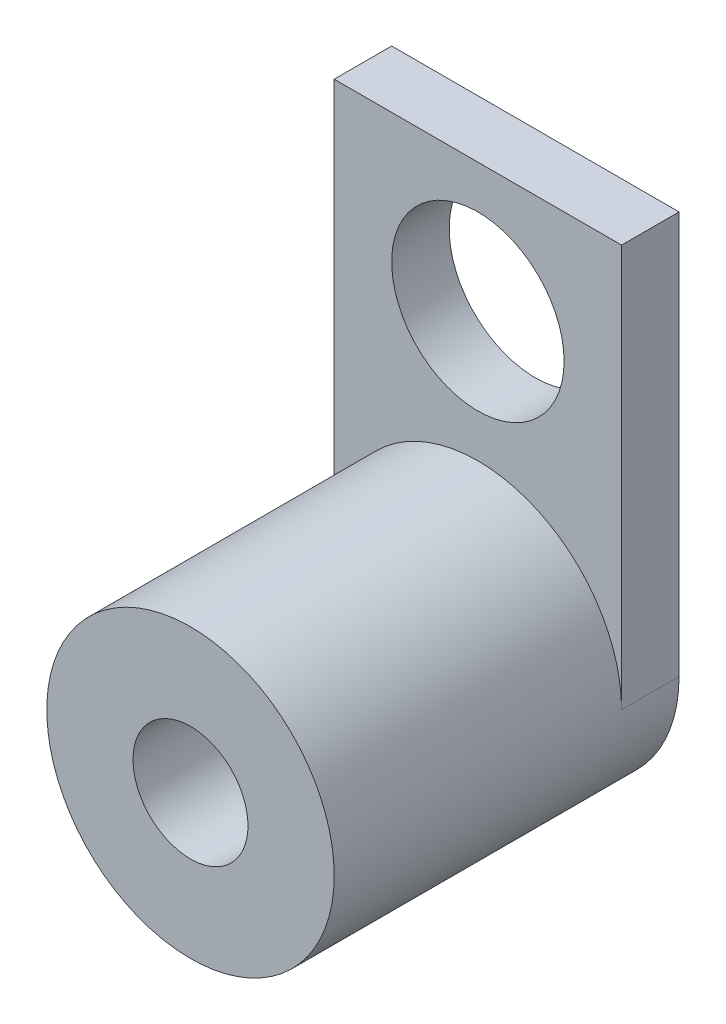
ISO-10303-21;
HEADER;
FILE_DESCRIPTION(('STEP AP214'),'2;1');
FILE_NAME('part.step','',(''),(''),'','','');
FILE_SCHEMA(('AUTOMOTIVE_DESIGN { 1 0 10303 214 1 1 1 1 }'));
ENDSEC;
DATA;
#1=APPLICATION_CONTEXT('core data for automotive mechanical design processes');
#2=APPLICATION_PROTOCOL_DEFINITION('international standard','automotive_design',2000,#1);
#3=PRODUCT_CONTEXT('',#1,'mechanical');
#4=PRODUCT('Part','Part','',(#3));
#5=PRODUCT_RELATED_PRODUCT_CATEGORY('part','',(#4));
#6=PRODUCT_DEFINITION_FORMATION('','',#4);
#7=PRODUCT_DEFINITION_CONTEXT('part definition',#1,'design');
#8=PRODUCT_DEFINITION('design','',#6,#7);
#9=PRODUCT_DEFINITION_SHAPE('','',#8);
#10=(LENGTH_UNIT() NAMED_UNIT(*) SI_UNIT(.MILLI.,.METRE.));
#11=(NAMED_UNIT(*) PLANE_ANGLE_UNIT() SI_UNIT($,.RADIAN.));
#12=(NAMED_UNIT(*) SI_UNIT($,.STERADIAN.) SOLID_ANGLE_UNIT());
#13=UNCERTAINTY_MEASURE_WITH_UNIT(LENGTH_MEASURE(1.E-05),#10,'distance_accuracy_value','');
#14=(GEOMETRIC_REPRESENTATION_CONTEXT(3) GLOBAL_UNCERTAINTY_ASSIGNED_CONTEXT((#13)) GLOBAL_UNIT_ASSIGNED_CONTEXT((#10,
#11,#12)) REPRESENTATION_CONTEXT('',''));
#15=CARTESIAN_POINT('',(0.,0.,0.));
#16=DIRECTION('',(0.,0.,1.));
#17=DIRECTION('',(1.,0.,0.));
#18=AXIS2_PLACEMENT_3D('',#15,#16,#17);
#19=CARTESIAN_POINT('',(0.,0.,152.4));
#20=DIRECTION('',(0.,0.,1.));
#21=DIRECTION('',(1.,0.,0.));
#22=AXIS2_PLACEMENT_3D('',#19,#20,#21);
#23=PLANE('',#22);
#24=CARTESIAN_POINT('',(0.,0.,152.4));
#25=DIRECTION('',(0.,0.,1.));
#26=DIRECTION('',(1.,0.,0.));
#27=AXIS2_PLACEMENT_3D('',#24,#25,#26);
#28=CIRCLE('',#27,63.5);
#29=CARTESIAN_POINT('',(63.5,0.,152.4));
#30=VERTEX_POINT('',#29);
#31=EDGE_CURVE('E11',#30,#30,#28,.T.);
#32=ORIENTED_EDGE('',*,*,#31,.T.);
#33=EDGE_LOOP('',(#32));
#34=FACE_BOUND('',#33,.T.);
#35=CARTESIAN_POINT('',(0.,0.,152.4));
#36=DIRECTION('',(0.,0.,1.));
#37=DIRECTION('',(1.,0.,0.));
#38=AXIS2_PLACEMENT_3D('',#35,#36,#37);
#39=CIRCLE('',#38,25.4);
#40=CARTESIAN_POINT('',(-25.4,0.,152.4));
#41=VERTEX_POINT('',#40);
#42=EDGE_CURVE('E134',#41,#41,#39,.T.);
#43=ORIENTED_EDGE('',*,*,#42,.F.);
#44=EDGE_LOOP('',(#43));
#45=FACE_BOUND('',#44,.T.);
#46=ADVANCED_FACE('F45',(#34,#45),#23,.T.);
#47=CARTESIAN_POINT('',(0.,0.,0.));
#48=DIRECTION('',(0.,0.,1.));
#49=DIRECTION('',(1.,0.,0.));
#50=AXIS2_PLACEMENT_3D('',#47,#48,#49);
#51=PLANE('',#50);
#52=CARTESIAN_POINT('',(0.,0.,0.));
#53=DIRECTION('',(0.,0.,1.));
#54=DIRECTION('',(1.,0.,0.));
#55=AXIS2_PLACEMENT_3D('',#52,#53,#54);
#56=CIRCLE('',#55,63.5);
#57=CARTESIAN_POINT('',(-63.5,0.,0.));
#58=VERTEX_POINT('',#57);
#59=CARTESIAN_POINT('',(63.5,0.,0.));
#60=VERTEX_POINT('',#59);
#61=EDGE_CURVE('E49',#58,#60,#56,.T.);
#62=ORIENTED_EDGE('',*,*,#61,.F.);
#63=DIRECTION('',(0.,-1.,0.));
#64=VECTOR('',#63,1.);
#65=CARTESIAN_POINT('',(-63.5,0.,0.));
#66=LINE('',#65,#64);
#67=CARTESIAN_POINT('',(-63.5,177.8,0.));
#68=VERTEX_POINT('',#67);
#69=EDGE_CURVE('E61',#68,#58,#66,.T.);
#70=ORIENTED_EDGE('',*,*,#69,.F.);
#71=DIRECTION('',(-1.,0.,0.));
#72=VECTOR('',#71,1.);
#73=CARTESIAN_POINT('',(-63.5,177.8,0.));
#74=LINE('',#73,#72);
#75=CARTESIAN_POINT('',(63.5,177.8,0.));
#76=VERTEX_POINT('',#75);
#77=EDGE_CURVE('E87',#76,#68,#74,.T.);
#78=ORIENTED_EDGE('',*,*,#77,.F.);
#79=DIRECTION('',(0.,1.,0.));
#80=VECTOR('',#79,1.);
#81=CARTESIAN_POINT('',(63.5,0.,0.));
#82=LINE('',#81,#80);
#83=EDGE_CURVE('E105',#60,#76,#82,.T.);
#84=ORIENTED_EDGE('',*,*,#83,.F.);
#85=EDGE_LOOP('',(#62,#70,#78,#84));
#86=FACE_BOUND('',#85,.T.);
#87=CARTESIAN_POINT('',(0.,0.,0.));
#88=DIRECTION('',(0.,0.,1.));
#89=DIRECTION('',(1.,0.,0.));
#90=AXIS2_PLACEMENT_3D('',#87,#88,#89);
#91=CIRCLE('',#90,25.4);
#92=CARTESIAN_POINT('',(-25.4,0.,0.));
#93=VERTEX_POINT('',#92);
#94=EDGE_CURVE('E133',#93,#93,#91,.T.);
#95=ORIENTED_EDGE('',*,*,#94,.T.);
#96=EDGE_LOOP('',(#95));
#97=FACE_BOUND('',#96,.T.);
#98=CARTESIAN_POINT('',(0.,120.65,0.));
#99=DIRECTION('',(0.,0.,1.));
#100=DIRECTION('',(1.,0.,0.));
#101=AXIS2_PLACEMENT_3D('',#98,#99,#100);
#102=CIRCLE('',#101,38.1);
#103=CARTESIAN_POINT('',(38.1,120.65,0.));
#104=VERTEX_POINT('',#103);
#105=EDGE_CURVE('E239',#104,#104,#102,.T.);
#106=ORIENTED_EDGE('',*,*,#105,.T.);
#107=EDGE_LOOP('',(#106));
#108=FACE_BOUND('',#107,.T.);
#109=ADVANCED_FACE('F142',(#86,#97,#108),#51,.F.);
#110=CARTESIAN_POINT('',(0.,0.,152.4));
#111=DIRECTION('',(0.,0.,-1.));
#112=DIRECTION('',(-1.,0.,0.));
#113=AXIS2_PLACEMENT_3D('',#110,#111,#112);
#114=CYLINDRICAL_SURFACE('',#113,63.5);
#115=ORIENTED_EDGE('',*,*,#31,.F.);
#116=EDGE_LOOP('',(#115));
#117=FACE_BOUND('',#116,.T.);
#118=CARTESIAN_POINT('',(0.,0.,25.4));
#119=DIRECTION('',(0.,0.,1.));
#120=DIRECTION('',(1.,0.,0.));
#121=AXIS2_PLACEMENT_3D('',#118,#119,#120);
#122=CIRCLE('',#121,63.5);
#123=CARTESIAN_POINT('',(63.5,0.,25.4));
#124=VERTEX_POINT('',#123);
#125=CARTESIAN_POINT('',(-63.5,0.,25.4));
#126=VERTEX_POINT('',#125);
#127=EDGE_CURVE('E91',#124,#126,#122,.T.);
#128=ORIENTED_EDGE('',*,*,#127,.T.);
#129=DIRECTION('',(0.,0.,-1.));
#130=VECTOR('',#129,1.);
#131=CARTESIAN_POINT('',(-63.5,0.,25.4));
#132=LINE('',#131,#130);
#133=EDGE_CURVE('E114',#126,#58,#132,.T.);
#134=ORIENTED_EDGE('',*,*,#133,.T.);
#135=ORIENTED_EDGE('',*,*,#61,.T.);
#136=DIRECTION('',(0.,0.,-1.));
#137=VECTOR('',#136,1.);
#138=CARTESIAN_POINT('',(63.5,0.,25.4));
#139=LINE('',#138,#137);
#140=EDGE_CURVE('E107',#124,#60,#139,.T.);
#141=ORIENTED_EDGE('',*,*,#140,.F.);
#142=EDGE_LOOP('',(#128,#134,#135,#141));
#143=FACE_BOUND('',#142,.T.);
#144=ADVANCED_FACE('F47',(#117,#143),#114,.T.);
#145=CARTESIAN_POINT('',(0.,0.,152.4));
#146=DIRECTION('',(0.,0.,-1.));
#147=DIRECTION('',(-1.,0.,0.));
#148=AXIS2_PLACEMENT_3D('',#145,#146,#147);
#149=CYLINDRICAL_SURFACE('',#148,25.4);
#150=CARTESIAN_POINT('',(-25.4,0.,152.4));
#151=CARTESIAN_POINT('',(-25.4,0.,150.8125));
#152=CARTESIAN_POINT('',(-25.4,0.,149.225));
#153=CARTESIAN_POINT('',(-25.4,0.,146.05));
#154=CARTESIAN_POINT('',(-25.4,0.,144.4625));
#155=CARTESIAN_POINT('',(-25.4,0.,141.2875));
#156=CARTESIAN_POINT('',(-25.4,0.,139.7));
#157=CARTESIAN_POINT('',(-25.4,0.,136.525));
#158=CARTESIAN_POINT('',(-25.4,0.,134.9375));
#159=CARTESIAN_POINT('',(-25.4,0.,131.7625));
#160=CARTESIAN_POINT('',(-25.4,0.,130.175));
#161=CARTESIAN_POINT('',(-25.4,0.,127.));
#162=CARTESIAN_POINT('',(-25.4,0.,125.4125));
#163=CARTESIAN_POINT('',(-25.4,0.,122.2375));
#164=CARTESIAN_POINT('',(-25.4,0.,120.65));
#165=CARTESIAN_POINT('',(-25.4,0.,117.475));
#166=CARTESIAN_POINT('',(-25.4,0.,115.8875));
#167=CARTESIAN_POINT('',(-25.4,0.,112.7125));
#168=CARTESIAN_POINT('',(-25.4,0.,111.125));
#169=CARTESIAN_POINT('',(-25.4,0.,107.95));
#170=CARTESIAN_POINT('',(-25.4,0.,106.3625));
#171=CARTESIAN_POINT('',(-25.4,0.,103.1875));
#172=CARTESIAN_POINT('',(-25.4,0.,101.6));
#173=CARTESIAN_POINT('',(-25.4,0.,98.425));
#174=CARTESIAN_POINT('',(-25.4,0.,96.8375));
#175=CARTESIAN_POINT('',(-25.4,0.,93.6625));
#176=CARTESIAN_POINT('',(-25.4,0.,92.075));
#177=CARTESIAN_POINT('',(-25.4,0.,88.9));
#178=CARTESIAN_POINT('',(-25.4,0.,87.3125));
#179=CARTESIAN_POINT('',(-25.4,0.,84.1375));
#180=CARTESIAN_POINT('',(-25.4,0.,82.55));
#181=CARTESIAN_POINT('',(-25.4,0.,79.375));
#182=CARTESIAN_POINT('',(-25.4,0.,77.7875));
#183=CARTESIAN_POINT('',(-25.4,0.,74.6125));
#184=CARTESIAN_POINT('',(-25.4,0.,73.025));
#185=CARTESIAN_POINT('',(-25.4,0.,69.85));
#186=CARTESIAN_POINT('',(-25.4,0.,68.2625));
#187=CARTESIAN_POINT('',(-25.4,0.,65.0875));
#188=CARTESIAN_POINT('',(-25.4,0.,63.5));
#189=CARTESIAN_POINT('',(-25.4,0.,60.325));
#190=CARTESIAN_POINT('',(-25.4,0.,58.7375));
#191=CARTESIAN_POINT('',(-25.4,0.,55.5625));
#192=CARTESIAN_POINT('',(-25.4,0.,53.975));
#193=CARTESIAN_POINT('',(-25.4,0.,50.8));
#194=CARTESIAN_POINT('',(-25.4,0.,49.2125));
#195=CARTESIAN_POINT('',(-25.4,0.,46.0375));
#196=CARTESIAN_POINT('',(-25.4,0.,44.45));
#197=CARTESIAN_POINT('',(-25.4,0.,41.275));
#198=CARTESIAN_POINT('',(-25.4,0.,39.6875));
#199=CARTESIAN_POINT('',(-25.4,0.,36.5125));
#200=CARTESIAN_POINT('',(-25.4,0.,34.925));
#201=CARTESIAN_POINT('',(-25.4,0.,31.75));
#202=CARTESIAN_POINT('',(-25.4,0.,30.1625));
#203=CARTESIAN_POINT('',(-25.4,0.,26.9875));
#204=CARTESIAN_POINT('',(-25.4,0.,25.4));
#205=CARTESIAN_POINT('',(-25.4,0.,22.225));
#206=CARTESIAN_POINT('',(-25.4,0.,20.6375));
#207=CARTESIAN_POINT('',(-25.4,0.,17.4625));
#208=CARTESIAN_POINT('',(-25.4,0.,15.875));
#209=CARTESIAN_POINT('',(-25.4,0.,12.7));
#210=CARTESIAN_POINT('',(-25.4,0.,11.1125));
#211=CARTESIAN_POINT('',(-25.4,0.,7.93750000000001));
#212=CARTESIAN_POINT('',(-25.4,0.,6.35));
#213=CARTESIAN_POINT('',(-25.4,0.,3.175));
#214=CARTESIAN_POINT('',(-25.4,0.,1.5875));
#215=CARTESIAN_POINT('',(-25.4,0.,0.));
#216=B_SPLINE_CURVE_WITH_KNOTS('',3,(#150,#151,#152,#153,#154,#155,#156,#157,#158,#159,#160,
#161,#162,#163,#164,#165,#166,#167,#168,#169,#170,#171,#172,#173,#174,#175,#176,#177,#178,#179,
#180,#181,#182,#183,#184,#185,#186,#187,#188,#189,#190,#191,#192,#193,#194,#195,#196,#197,#198,
#199,#200,#201,#202,#203,#204,#205,#206,#207,#208,#209,#210,#211,#212,#213,#214,#215),
.UNSPECIFIED.,.F.,.F.,(4,2,2,2,2,2,2,2,2,2,2,2,2,2,2,2,2,2,2,2,2,2,2,2,2,2,2,2,2,2,2,2,4),(0.,
4.76249999999998,9.52499999999998,14.2875,19.05,23.8125,28.575,33.3375,38.1,42.8625,47.625,
52.3875,57.15,61.9125,66.675,71.4375,76.2,80.9625,85.725,90.4875,95.25,100.0125,104.775,
109.5375,114.3,119.0625,123.825,128.5875,133.35,138.1125,142.875,147.6375,152.4),.UNSPECIFIED.);
#217=EDGE_CURVE('BSEAM145',#41,#93,#216,.T.);
#218=ORIENTED_EDGE('',*,*,#42,.T.);
#219=ORIENTED_EDGE('',*,*,#94,.F.);
#220=ORIENTED_EDGE('',*,*,#217,.T.);
#221=ORIENTED_EDGE('',*,*,#217,.F.);
#222=EDGE_LOOP('',(#218,#220,#219,#221));
#223=FACE_BOUND('',#222,.T.);
#224=ADVANCED_FACE('F145',(#223),#149,.F.);
#225=CARTESIAN_POINT('',(0.,0.,25.4));
#226=DIRECTION('',(0.,0.,1.));
#227=DIRECTION('',(1.,0.,0.));
#228=AXIS2_PLACEMENT_3D('',#225,#226,#227);
#229=PLANE('',#228);
#230=CARTESIAN_POINT('',(0.,120.65,25.4));
#231=DIRECTION('',(0.,0.,1.));
#232=DIRECTION('',(1.,0.,0.));
#233=AXIS2_PLACEMENT_3D('',#230,#231,#232);
#234=CIRCLE('',#233,38.1);
#235=CARTESIAN_POINT('',(38.1,120.65,25.4));
#236=VERTEX_POINT('',#235);
#237=EDGE_CURVE('E120',#236,#236,#234,.T.);
#238=ORIENTED_EDGE('',*,*,#237,.F.);
#239=EDGE_LOOP('',(#238));
#240=FACE_BOUND('',#239,.T.);
#241=ORIENTED_EDGE('',*,*,#127,.F.);
#242=DIRECTION('',(0.,1.,0.));
#243=VECTOR('',#242,1.);
#244=CARTESIAN_POINT('',(63.5,0.,25.4));
#245=LINE('',#244,#243);
#246=CARTESIAN_POINT('',(63.5,177.8,25.4));
#247=VERTEX_POINT('',#246);
#248=EDGE_CURVE('E93',#124,#247,#245,.T.);
#249=ORIENTED_EDGE('',*,*,#248,.T.);
#250=DIRECTION('',(-1.,0.,0.));
#251=VECTOR('',#250,1.);
#252=CARTESIAN_POINT('',(-63.5,177.8,25.4));
#253=LINE('',#252,#251);
#254=CARTESIAN_POINT('',(-63.5,177.8,25.4));
#255=VERTEX_POINT('',#254);
#256=EDGE_CURVE('E97',#247,#255,#253,.T.);
#257=ORIENTED_EDGE('',*,*,#256,.T.);
#258=DIRECTION('',(0.,-1.,0.));
#259=VECTOR('',#258,1.);
#260=CARTESIAN_POINT('',(-63.5,0.,25.4));
#261=LINE('',#260,#259);
#262=EDGE_CURVE('E70',#255,#126,#261,.T.);
#263=ORIENTED_EDGE('',*,*,#262,.T.);
#264=EDGE_LOOP('',(#241,#249,#257,#263));
#265=FACE_BOUND('',#264,.T.);
#266=ADVANCED_FACE('F95',(#240,#265),#229,.T.);
#267=CARTESIAN_POINT('',(63.5,0.,25.4));
#268=DIRECTION('',(-1.,0.,0.));
#269=DIRECTION('',(0.,-1.,0.));
#270=AXIS2_PLACEMENT_3D('',#267,#268,#269);
#271=PLANE('',#270);
#272=ORIENTED_EDGE('',*,*,#83,.T.);
#273=DIRECTION('',(0.,0.,-1.));
#274=VECTOR('',#273,1.);
#275=CARTESIAN_POINT('',(63.5,177.8,25.4));
#276=LINE('',#275,#274);
#277=EDGE_CURVE('E103',#247,#76,#276,.T.);
#278=ORIENTED_EDGE('',*,*,#277,.F.);
#279=ORIENTED_EDGE('',*,*,#248,.F.);
#280=ORIENTED_EDGE('',*,*,#140,.T.);
#281=EDGE_LOOP('',(#272,#278,#279,#280));
#282=FACE_BOUND('',#281,.T.);
#283=ADVANCED_FACE('F104',(#282),#271,.F.);
#284=CARTESIAN_POINT('',(-63.5,177.8,25.4));
#285=DIRECTION('',(0.,-1.,0.));
#286=DIRECTION('',(0.,0.,-1.));
#287=AXIS2_PLACEMENT_3D('',#284,#285,#286);
#288=PLANE('',#287);
#289=ORIENTED_EDGE('',*,*,#77,.T.);
#290=DIRECTION('',(0.,0.,-1.));
#291=VECTOR('',#290,1.);
#292=CARTESIAN_POINT('',(-63.5,177.8,25.4));
#293=LINE('',#292,#291);
#294=EDGE_CURVE('E108',#255,#68,#293,.T.);
#295=ORIENTED_EDGE('',*,*,#294,.F.);
#296=ORIENTED_EDGE('',*,*,#256,.F.);
#297=ORIENTED_EDGE('',*,*,#277,.T.);
#298=EDGE_LOOP('',(#289,#295,#296,#297));
#299=FACE_BOUND('',#298,.T.);
#300=ADVANCED_FACE('F110',(#299),#288,.F.);
#301=CARTESIAN_POINT('',(-63.5,0.,25.4));
#302=DIRECTION('',(1.,0.,0.));
#303=DIRECTION('',(0.,1.,0.));
#304=AXIS2_PLACEMENT_3D('',#301,#302,#303);
#305=PLANE('',#304);
#306=ORIENTED_EDGE('',*,*,#69,.T.);
#307=ORIENTED_EDGE('',*,*,#133,.F.);
#308=ORIENTED_EDGE('',*,*,#262,.F.);
#309=ORIENTED_EDGE('',*,*,#294,.T.);
#310=EDGE_LOOP('',(#306,#307,#308,#309));
#311=FACE_BOUND('',#310,.T.);
#312=ADVANCED_FACE('F171',(#311),#305,.F.);
#313=CARTESIAN_POINT('',(0.,120.65,25.4));
#314=DIRECTION('',(0.,0.,-1.));
#315=DIRECTION('',(-1.,0.,0.));
#316=AXIS2_PLACEMENT_3D('',#313,#314,#315);
#317=CYLINDRICAL_SURFACE('',#316,38.1);
#318=ORIENTED_EDGE('',*,*,#237,.T.);
#319=EDGE_LOOP('',(#318));
#320=FACE_BOUND('',#319,.T.);
#321=ORIENTED_EDGE('',*,*,#105,.F.);
#322=EDGE_LOOP('',(#321));
#323=FACE_BOUND('',#322,.T.);
#324=ADVANCED_FACE('F173',(#320,#323),#317,.F.);
#325=CLOSED_SHELL('',(#46,#109,#144,#224,#266,#283,#300,#312,#324));
#326=MANIFOLD_SOLID_BREP('B2',#325);
#327=ADVANCED_BREP_SHAPE_REPRESENTATION('',(#18,#326),#14);
#328=SHAPE_DEFINITION_REPRESENTATION(#9,#327);
ENDSEC;
END-ISO-10303-21;
